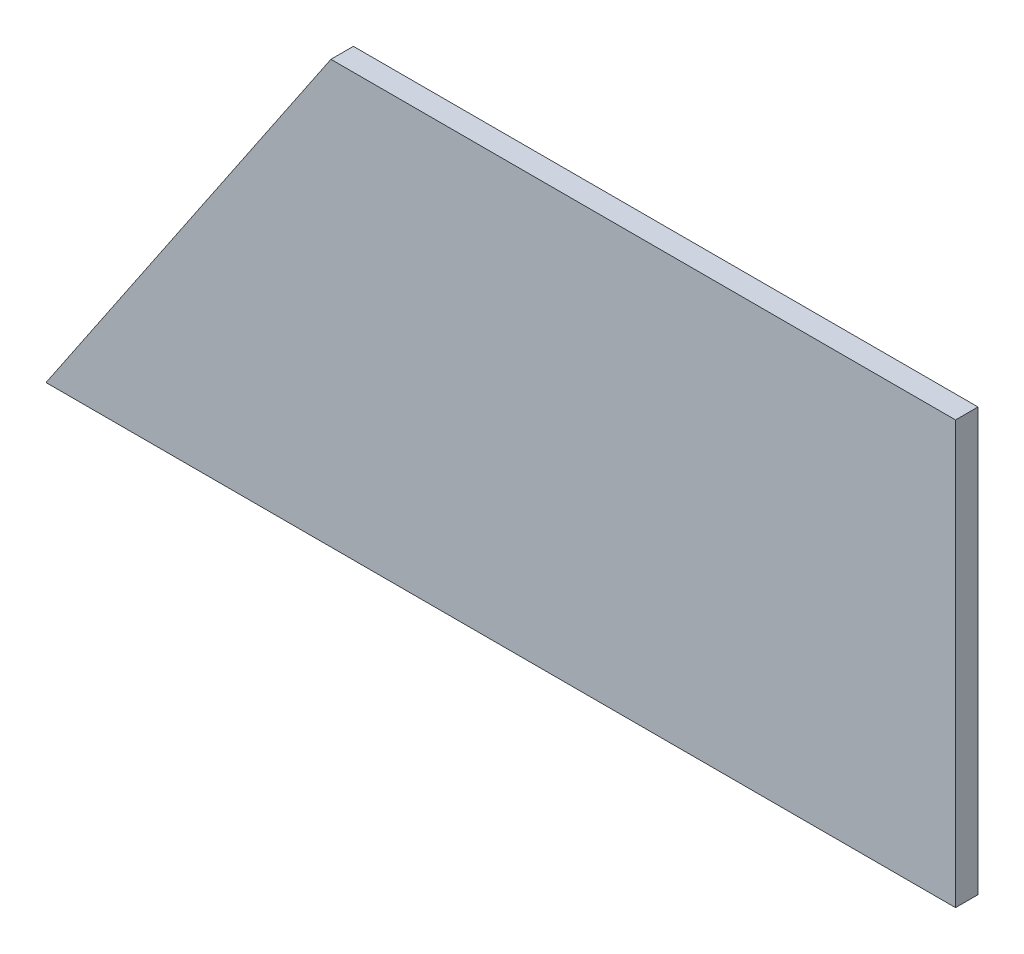
ISO-10303-21;
HEADER;
FILE_DESCRIPTION(('STEP AP214'),'2;1');
FILE_NAME('part.step','',(''),(''),'','','');
FILE_SCHEMA(('AUTOMOTIVE_DESIGN { 1 0 10303 214 1 1 1 1 }'));
ENDSEC;
DATA;
#1=APPLICATION_CONTEXT('core data for automotive mechanical design processes');
#2=APPLICATION_PROTOCOL_DEFINITION('international standard','automotive_design',2000,#1);
#3=PRODUCT_CONTEXT('',#1,'mechanical');
#4=PRODUCT('Part','Part','',(#3));
#5=PRODUCT_RELATED_PRODUCT_CATEGORY('part','',(#4));
#6=PRODUCT_DEFINITION_FORMATION('','',#4);
#7=PRODUCT_DEFINITION_CONTEXT('part definition',#1,'design');
#8=PRODUCT_DEFINITION('design','',#6,#7);
#9=PRODUCT_DEFINITION_SHAPE('','',#8);
#10=(LENGTH_UNIT() NAMED_UNIT(*) SI_UNIT(.MILLI.,.METRE.));
#11=(NAMED_UNIT(*) PLANE_ANGLE_UNIT() SI_UNIT($,.RADIAN.));
#12=(NAMED_UNIT(*) SI_UNIT($,.STERADIAN.) SOLID_ANGLE_UNIT());
#13=UNCERTAINTY_MEASURE_WITH_UNIT(LENGTH_MEASURE(1.E-05),#10,'distance_accuracy_value','');
#14=(GEOMETRIC_REPRESENTATION_CONTEXT(3) GLOBAL_UNCERTAINTY_ASSIGNED_CONTEXT((#13)) GLOBAL_UNIT_ASSIGNED_CONTEXT((#10,
#11,#12)) REPRESENTATION_CONTEXT('',''));
#15=CARTESIAN_POINT('',(0.,0.,0.));
#16=DIRECTION('',(0.,0.,1.));
#17=DIRECTION('',(1.,0.,0.));
#18=AXIS2_PLACEMENT_3D('',#15,#16,#17);
#19=CARTESIAN_POINT('',(1028.2113069626,0.,25.4));
#20=DIRECTION('',(0.,1.,0.));
#21=DIRECTION('',(0.,0.,1.));
#22=AXIS2_PLACEMENT_3D('',#19,#20,#21);
#23=PLANE('',#22);
#24=DIRECTION('',(1.,0.,0.));
#25=VECTOR('',#24,1.);
#26=CARTESIAN_POINT('',(1028.2113069626,0.,0.));
#27=LINE('',#26,#25);
#28=CARTESIAN_POINT('',(0.,0.,0.));
#29=VERTEX_POINT('',#28);
#30=CARTESIAN_POINT('',(1028.2113069626,0.,0.));
#31=VERTEX_POINT('',#30);
#32=EDGE_CURVE('E101',#29,#31,#27,.T.);
#33=ORIENTED_EDGE('',*,*,#32,.T.);
#34=DIRECTION('',(0.,0.,-1.));
#35=VECTOR('',#34,1.);
#36=CARTESIAN_POINT('',(1028.2113069626,0.,25.4));
#37=LINE('',#36,#35);
#38=CARTESIAN_POINT('',(1028.2113069626,0.,25.4));
#39=VERTEX_POINT('',#38);
#40=EDGE_CURVE('E11',#39,#31,#37,.T.);
#41=ORIENTED_EDGE('',*,*,#40,.F.);
#42=DIRECTION('',(1.,0.,0.));
#43=VECTOR('',#42,1.);
#44=CARTESIAN_POINT('',(1028.2113069626,0.,25.4));
#45=LINE('',#44,#43);
#46=CARTESIAN_POINT('',(0.,0.,25.4));
#47=VERTEX_POINT('',#46);
#48=EDGE_CURVE('E89',#47,#39,#45,.T.);
#49=ORIENTED_EDGE('',*,*,#48,.F.);
#50=DIRECTION('',(0.,0.,-1.));
#51=VECTOR('',#50,1.);
#52=CARTESIAN_POINT('',(0.,0.,25.4));
#53=LINE('',#52,#51);
#54=EDGE_CURVE('E97',#47,#29,#53,.T.);
#55=ORIENTED_EDGE('',*,*,#54,.T.);
#56=EDGE_LOOP('',(#33,#41,#49,#55));
#57=FACE_BOUND('',#56,.T.);
#58=ADVANCED_FACE('F38',(#57),#23,.F.);
#59=CARTESIAN_POINT('',(1028.2113069626,477.52,25.4));
#60=DIRECTION('',(-1.,0.,0.));
#61=DIRECTION('',(0.,0.,1.));
#62=AXIS2_PLACEMENT_3D('',#59,#60,#61);
#63=PLANE('',#62);
#64=DIRECTION('',(0.,1.,0.));
#65=VECTOR('',#64,1.);
#66=CARTESIAN_POINT('',(1028.2113069626,477.52,0.));
#67=LINE('',#66,#65);
#68=CARTESIAN_POINT('',(1028.2113069626,477.52,0.));
#69=VERTEX_POINT('',#68);
#70=EDGE_CURVE('E93',#31,#69,#67,.T.);
#71=ORIENTED_EDGE('',*,*,#70,.T.);
#72=DIRECTION('',(0.,0.,-1.));
#73=VECTOR('',#72,1.);
#74=CARTESIAN_POINT('',(1028.2113069626,477.52,25.4));
#75=LINE('',#74,#73);
#76=CARTESIAN_POINT('',(1028.2113069626,477.52,25.4));
#77=VERTEX_POINT('',#76);
#78=EDGE_CURVE('E46',#77,#69,#75,.T.);
#79=ORIENTED_EDGE('',*,*,#78,.F.);
#80=DIRECTION('',(0.,1.,0.));
#81=VECTOR('',#80,1.);
#82=CARTESIAN_POINT('',(1028.2113069626,477.52,25.4));
#83=LINE('',#82,#81);
#84=EDGE_CURVE('E84',#39,#77,#83,.T.);
#85=ORIENTED_EDGE('',*,*,#84,.F.);
#86=ORIENTED_EDGE('',*,*,#40,.T.);
#87=EDGE_LOOP('',(#71,#79,#85,#86));
#88=FACE_BOUND('',#87,.T.);
#89=ADVANCED_FACE('F92',(#88),#63,.F.);
#90=CARTESIAN_POINT('',(322.091306962599,477.52,25.4));
#91=DIRECTION('',(0.,-1.,0.));
#92=DIRECTION('',(0.,0.,-1.));
#93=AXIS2_PLACEMENT_3D('',#90,#91,#92);
#94=PLANE('',#93);
#95=DIRECTION('',(-1.,0.,0.));
#96=VECTOR('',#95,1.);
#97=CARTESIAN_POINT('',(322.091306962599,477.52,0.));
#98=LINE('',#97,#96);
#99=CARTESIAN_POINT('',(322.091306962599,477.52,0.));
#100=VERTEX_POINT('',#99);
#101=EDGE_CURVE('E71',#69,#100,#98,.T.);
#102=ORIENTED_EDGE('',*,*,#101,.T.);
#103=DIRECTION('',(0.,0.,-1.));
#104=VECTOR('',#103,1.);
#105=CARTESIAN_POINT('',(322.091306962599,477.52,25.4));
#106=LINE('',#105,#104);
#107=CARTESIAN_POINT('',(322.091306962599,477.52,25.4));
#108=VERTEX_POINT('',#107);
#109=EDGE_CURVE('E94',#108,#100,#106,.T.);
#110=ORIENTED_EDGE('',*,*,#109,.F.);
#111=DIRECTION('',(-1.,0.,0.));
#112=VECTOR('',#111,1.);
#113=CARTESIAN_POINT('',(322.091306962599,477.52,25.4));
#114=LINE('',#113,#112);
#115=EDGE_CURVE('E87',#77,#108,#114,.T.);
#116=ORIENTED_EDGE('',*,*,#115,.F.);
#117=ORIENTED_EDGE('',*,*,#78,.T.);
#118=EDGE_LOOP('',(#102,#110,#116,#117));
#119=FACE_BOUND('',#118,.T.);
#120=ADVANCED_FACE('F95',(#119),#94,.F.);
#121=CARTESIAN_POINT('',(0.,0.,25.4));
#122=DIRECTION('',(0.829037572555039,-0.559192903470751,0.));
#123=DIRECTION('',(0.559192903470751,0.829037572555039,0.));
#124=AXIS2_PLACEMENT_3D('',#121,#122,#123);
#125=PLANE('',#124);
#126=DIRECTION('',(-0.559192903470751,-0.829037572555039,0.));
#127=VECTOR('',#126,1.);
#128=CARTESIAN_POINT('',(0.,0.,0.));
#129=LINE('',#128,#127);
#130=EDGE_CURVE('E77',#100,#29,#129,.T.);
#131=ORIENTED_EDGE('',*,*,#130,.T.);
#132=ORIENTED_EDGE('',*,*,#54,.F.);
#133=DIRECTION('',(-0.559192903470751,-0.829037572555039,0.));
#134=VECTOR('',#133,1.);
#135=CARTESIAN_POINT('',(0.,0.,25.4));
#136=LINE('',#135,#134);
#137=EDGE_CURVE('E54',#108,#47,#136,.T.);
#138=ORIENTED_EDGE('',*,*,#137,.F.);
#139=ORIENTED_EDGE('',*,*,#109,.T.);
#140=EDGE_LOOP('',(#131,#132,#138,#139));
#141=FACE_BOUND('',#140,.T.);
#142=ADVANCED_FACE('F108',(#141),#125,.F.);
#143=CARTESIAN_POINT('',(0.,0.,25.4));
#144=DIRECTION('',(0.,0.,1.));
#145=DIRECTION('',(1.,0.,0.));
#146=AXIS2_PLACEMENT_3D('',#143,#144,#145);
#147=PLANE('',#146);
#148=ORIENTED_EDGE('',*,*,#48,.T.);
#149=ORIENTED_EDGE('',*,*,#84,.T.);
#150=ORIENTED_EDGE('',*,*,#115,.T.);
#151=ORIENTED_EDGE('',*,*,#137,.T.);
#152=EDGE_LOOP('',(#148,#149,#150,#151));
#153=FACE_BOUND('',#152,.T.);
#154=ADVANCED_FACE('F85',(#153),#147,.T.);
#155=CARTESIAN_POINT('',(0.,0.,0.));
#156=DIRECTION('',(0.,0.,1.));
#157=DIRECTION('',(1.,0.,0.));
#158=AXIS2_PLACEMENT_3D('',#155,#156,#157);
#159=PLANE('',#158);
#160=ORIENTED_EDGE('',*,*,#32,.F.);
#161=ORIENTED_EDGE('',*,*,#130,.F.);
#162=ORIENTED_EDGE('',*,*,#101,.F.);
#163=ORIENTED_EDGE('',*,*,#70,.F.);
#164=EDGE_LOOP('',(#160,#161,#162,#163));
#165=FACE_BOUND('',#164,.T.);
#166=ADVANCED_FACE('F111',(#165),#159,.F.);
#167=CLOSED_SHELL('',(#58,#89,#120,#142,#154,#166));
#168=MANIFOLD_SOLID_BREP('B2',#167);
#169=ADVANCED_BREP_SHAPE_REPRESENTATION('',(#18,#168),#14);
#170=SHAPE_DEFINITION_REPRESENTATION(#9,#169);
ENDSEC;
END-ISO-10303-21;
